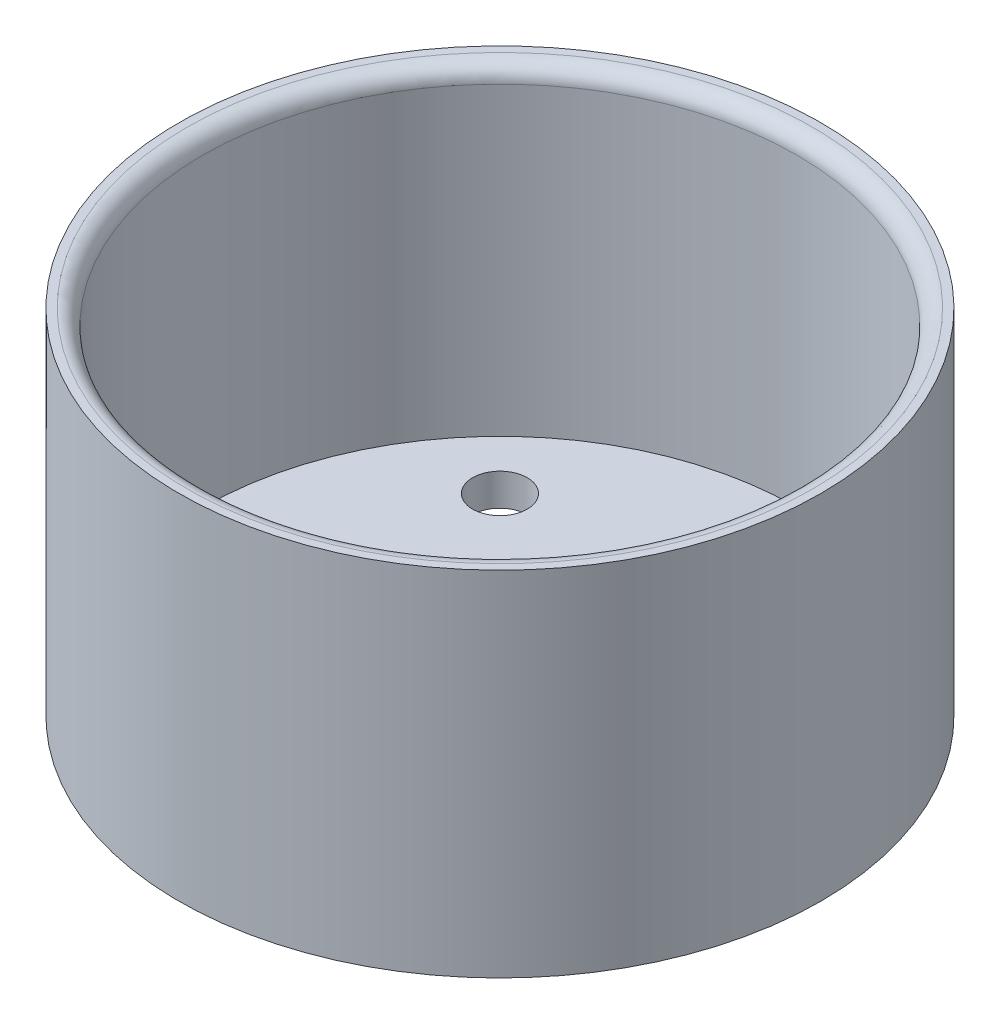
ISO-10303-21;
HEADER;
FILE_DESCRIPTION(('STEP AP214'),'2;1');
FILE_NAME('part.step','',(''),(''),'','','');
FILE_SCHEMA(('AUTOMOTIVE_DESIGN { 1 0 10303 214 1 1 1 1 }'));
ENDSEC;
DATA;
#1=APPLICATION_CONTEXT('core data for automotive mechanical design processes');
#2=APPLICATION_PROTOCOL_DEFINITION('international standard','automotive_design',2000,#1);
#3=PRODUCT_CONTEXT('',#1,'mechanical');
#4=PRODUCT('Part','Part','',(#3));
#5=PRODUCT_RELATED_PRODUCT_CATEGORY('part','',(#4));
#6=PRODUCT_DEFINITION_FORMATION('','',#4);
#7=PRODUCT_DEFINITION_CONTEXT('part definition',#1,'design');
#8=PRODUCT_DEFINITION('design','',#6,#7);
#9=PRODUCT_DEFINITION_SHAPE('','',#8);
#10=(LENGTH_UNIT() NAMED_UNIT(*) SI_UNIT(.MILLI.,.METRE.));
#11=(NAMED_UNIT(*) PLANE_ANGLE_UNIT() SI_UNIT($,.RADIAN.));
#12=(NAMED_UNIT(*) SI_UNIT($,.STERADIAN.) SOLID_ANGLE_UNIT());
#13=UNCERTAINTY_MEASURE_WITH_UNIT(LENGTH_MEASURE(1.E-05),#10,'distance_accuracy_value','');
#14=(GEOMETRIC_REPRESENTATION_CONTEXT(3) GLOBAL_UNCERTAINTY_ASSIGNED_CONTEXT((#13)) GLOBAL_UNIT_ASSIGNED_CONTEXT((#10,
#11,#12)) REPRESENTATION_CONTEXT('',''));
#15=CARTESIAN_POINT('',(0.,0.,0.));
#16=DIRECTION('',(0.,0.,1.));
#17=DIRECTION('',(1.,0.,0.));
#18=AXIS2_PLACEMENT_3D('',#15,#16,#17);
#19=CARTESIAN_POINT('',(-1.52655665885958E-13,22.,0.));
#20=DIRECTION('',(0.,1.,0.));
#21=DIRECTION('',(-1.,0.,0.));
#22=AXIS2_PLACEMENT_3D('',#19,#20,#21);
#23=PLANE('',#22);
#24=CARTESIAN_POINT('',(0.,22.,0.));
#25=DIRECTION('',(0.,-1.,0.));
#26=DIRECTION('',(1.,0.,0.));
#27=AXIS2_PLACEMENT_3D('',#24,#25,#26);
#28=CIRCLE('',#27,19.5);
#29=CARTESIAN_POINT('',(19.5,22.,0.));
#30=VERTEX_POINT('',#29);
#31=EDGE_CURVE('E10',#30,#30,#28,.T.);
#32=ORIENTED_EDGE('',*,*,#31,.T.);
#33=EDGE_LOOP('',(#32));
#34=FACE_BOUND('',#33,.T.);
#35=CARTESIAN_POINT('',(0.,22.,0.));
#36=DIRECTION('',(0.,-1.,0.));
#37=DIRECTION('',(1.,0.,0.));
#38=AXIS2_PLACEMENT_3D('',#35,#36,#37);
#39=CIRCLE('',#38,20.);
#40=CARTESIAN_POINT('',(20.,22.,0.));
#41=VERTEX_POINT('',#40);
#42=EDGE_CURVE('E62',#41,#41,#39,.T.);
#43=ORIENTED_EDGE('',*,*,#42,.F.);
#44=EDGE_LOOP('',(#43));
#45=FACE_BOUND('',#44,.T.);
#46=ADVANCED_FACE('F35',(#34,#45),#23,.T.);
#47=CARTESIAN_POINT('',(0.,21.,0.));
#48=DIRECTION('',(0.,-1.,0.));
#49=DIRECTION('',(1.,0.,0.));
#50=AXIS2_PLACEMENT_3D('',#47,#48,#49);
#51=TOROIDAL_SURFACE('',#50,19.5,0.999999999999999);
#52=CARTESIAN_POINT('',(0.,21.,0.));
#53=DIRECTION('',(0.,-1.,0.));
#54=DIRECTION('',(1.,0.,0.));
#55=AXIS2_PLACEMENT_3D('',#52,#53,#54);
#56=CIRCLE('',#55,18.5);
#57=CARTESIAN_POINT('',(18.5,21.,0.));
#58=VERTEX_POINT('',#57);
#59=EDGE_CURVE('E42',#58,#58,#56,.T.);
#60=ORIENTED_EDGE('',*,*,#59,.T.);
#61=EDGE_LOOP('',(#60));
#62=FACE_BOUND('',#61,.T.);
#63=ORIENTED_EDGE('',*,*,#31,.F.);
#64=EDGE_LOOP('',(#63));
#65=FACE_BOUND('',#64,.T.);
#66=ADVANCED_FACE('F91',(#62,#65),#51,.T.);
#67=CARTESIAN_POINT('',(0.,0.,0.));
#68=DIRECTION('',(0.,-1.,0.));
#69=DIRECTION('',(1.,0.,0.));
#70=AXIS2_PLACEMENT_3D('',#67,#68,#69);
#71=CYLINDRICAL_SURFACE('',#70,18.5);
#72=ORIENTED_EDGE('',*,*,#59,.F.);
#73=EDGE_LOOP('',(#72));
#74=FACE_BOUND('',#73,.T.);
#75=CARTESIAN_POINT('',(0.,2.,0.));
#76=DIRECTION('',(0.,-1.,0.));
#77=DIRECTION('',(1.,0.,0.));
#78=AXIS2_PLACEMENT_3D('',#75,#76,#77);
#79=CIRCLE('',#78,18.5);
#80=CARTESIAN_POINT('',(18.5,2.,0.));
#81=VERTEX_POINT('',#80);
#82=EDGE_CURVE('E47',#81,#81,#79,.T.);
#83=ORIENTED_EDGE('',*,*,#82,.T.);
#84=EDGE_LOOP('',(#83));
#85=FACE_BOUND('',#84,.T.);
#86=ADVANCED_FACE('F77',(#74,#85),#71,.F.);
#87=CARTESIAN_POINT('',(0.,2.,0.));
#88=DIRECTION('',(0.,-1.,0.));
#89=DIRECTION('',(1.,0.,0.));
#90=AXIS2_PLACEMENT_3D('',#87,#88,#89);
#91=PLANE('',#90);
#92=CARTESIAN_POINT('',(10.0000000000001,2.,-9.9999999999999));
#93=DIRECTION('',(0.,1.,0.));
#94=DIRECTION('',(-1.,0.,0.));
#95=AXIS2_PLACEMENT_3D('',#92,#93,#94);
#96=CIRCLE('',#95,1.7);
#97=CARTESIAN_POINT('',(8.30000000000011,2.,-9.9999999999999));
#98=VERTEX_POINT('',#97);
#99=EDGE_CURVE('E177',#98,#98,#96,.T.);
#100=ORIENTED_EDGE('',*,*,#99,.F.);
#101=EDGE_LOOP('',(#100));
#102=FACE_BOUND('',#101,.T.);
#103=CARTESIAN_POINT('',(-9.99999999999993,2.,-10.0000000000001));
#104=DIRECTION('',(0.,1.,0.));
#105=DIRECTION('',(-1.,0.,0.));
#106=AXIS2_PLACEMENT_3D('',#103,#104,#105);
#107=CIRCLE('',#106,1.7);
#108=CARTESIAN_POINT('',(-11.6999999999999,2.,-10.0000000000001));
#109=VERTEX_POINT('',#108);
#110=EDGE_CURVE('E178',#109,#109,#107,.T.);
#111=ORIENTED_EDGE('',*,*,#110,.F.);
#112=EDGE_LOOP('',(#111));
#113=FACE_BOUND('',#112,.T.);
#114=CARTESIAN_POINT('',(-10.,2.,9.99999999999996));
#115=DIRECTION('',(0.,1.,0.));
#116=DIRECTION('',(-1.,0.,0.));
#117=AXIS2_PLACEMENT_3D('',#114,#115,#116);
#118=CIRCLE('',#117,1.7);
#119=CARTESIAN_POINT('',(-11.7,2.,9.99999999999996));
#120=VERTEX_POINT('',#119);
#121=EDGE_CURVE('E180',#120,#120,#118,.T.);
#122=ORIENTED_EDGE('',*,*,#121,.F.);
#123=EDGE_LOOP('',(#122));
#124=FACE_BOUND('',#123,.T.);
#125=CARTESIAN_POINT('',(10.,2.,10.));
#126=DIRECTION('',(0.,1.,0.));
#127=DIRECTION('',(-1.,0.,0.));
#128=AXIS2_PLACEMENT_3D('',#125,#126,#127);
#129=CIRCLE('',#128,1.7);
#130=CARTESIAN_POINT('',(8.3,2.,10.));
#131=VERTEX_POINT('',#130);
#132=EDGE_CURVE('E55',#131,#131,#129,.T.);
#133=ORIENTED_EDGE('',*,*,#132,.F.);
#134=EDGE_LOOP('',(#133));
#135=FACE_BOUND('',#134,.T.);
#136=ORIENTED_EDGE('',*,*,#82,.F.);
#137=EDGE_LOOP('',(#136));
#138=FACE_BOUND('',#137,.T.);
#139=ADVANCED_FACE('F79',(#102,#113,#124,#135,#138),#91,.F.);
#140=CARTESIAN_POINT('',(0.,0.,0.));
#141=DIRECTION('',(0.,-1.,0.));
#142=DIRECTION('',(1.,0.,0.));
#143=AXIS2_PLACEMENT_3D('',#140,#141,#142);
#144=PLANE('',#143);
#145=CARTESIAN_POINT('',(10.0000000000001,0.,-9.9999999999999));
#146=DIRECTION('',(0.,-1.,0.));
#147=DIRECTION('',(1.,0.,0.));
#148=AXIS2_PLACEMENT_3D('',#145,#146,#147);
#149=CIRCLE('',#148,1.7);
#150=CARTESIAN_POINT('',(11.7000000000001,0.,-9.9999999999999));
#151=VERTEX_POINT('',#150);
#152=EDGE_CURVE('E38',#151,#151,#149,.T.);
#153=ORIENTED_EDGE('',*,*,#152,.F.);
#154=EDGE_LOOP('',(#153));
#155=FACE_BOUND('',#154,.T.);
#156=CARTESIAN_POINT('',(-9.99999999999993,0.,-10.0000000000001));
#157=DIRECTION('',(0.,-1.,0.));
#158=DIRECTION('',(1.,0.,0.));
#159=AXIS2_PLACEMENT_3D('',#156,#157,#158);
#160=CIRCLE('',#159,1.7);
#161=CARTESIAN_POINT('',(-8.29999999999993,0.,-10.0000000000001));
#162=VERTEX_POINT('',#161);
#163=EDGE_CURVE('E57',#162,#162,#160,.T.);
#164=ORIENTED_EDGE('',*,*,#163,.F.);
#165=EDGE_LOOP('',(#164));
#166=FACE_BOUND('',#165,.T.);
#167=CARTESIAN_POINT('',(-10.,0.,9.99999999999996));
#168=DIRECTION('',(0.,-1.,0.));
#169=DIRECTION('',(1.,0.,0.));
#170=AXIS2_PLACEMENT_3D('',#167,#168,#169);
#171=CIRCLE('',#170,1.7);
#172=CARTESIAN_POINT('',(-8.30000000000003,0.,9.99999999999996));
#173=VERTEX_POINT('',#172);
#174=EDGE_CURVE('E54',#173,#173,#171,.T.);
#175=ORIENTED_EDGE('',*,*,#174,.F.);
#176=EDGE_LOOP('',(#175));
#177=FACE_BOUND('',#176,.T.);
#178=CARTESIAN_POINT('',(10.,0.,10.));
#179=DIRECTION('',(0.,-1.,0.));
#180=DIRECTION('',(1.,0.,0.));
#181=AXIS2_PLACEMENT_3D('',#178,#179,#180);
#182=CIRCLE('',#181,1.7);
#183=CARTESIAN_POINT('',(11.7,0.,10.));
#184=VERTEX_POINT('',#183);
#185=EDGE_CURVE('E51',#184,#184,#182,.T.);
#186=ORIENTED_EDGE('',*,*,#185,.F.);
#187=EDGE_LOOP('',(#186));
#188=FACE_BOUND('',#187,.T.);
#189=CARTESIAN_POINT('',(0.,0.,0.));
#190=DIRECTION('',(0.,-1.,0.));
#191=DIRECTION('',(1.,0.,0.));
#192=AXIS2_PLACEMENT_3D('',#189,#190,#191);
#193=CIRCLE('',#192,20.);
#194=CARTESIAN_POINT('',(20.,0.,0.));
#195=VERTEX_POINT('',#194);
#196=EDGE_CURVE('E66',#195,#195,#193,.T.);
#197=ORIENTED_EDGE('',*,*,#196,.T.);
#198=EDGE_LOOP('',(#197));
#199=FACE_BOUND('',#198,.T.);
#200=ADVANCED_FACE('F81',(#155,#166,#177,#188,#199),#144,.T.);
#201=CARTESIAN_POINT('',(0.,0.,0.));
#202=DIRECTION('',(0.,-1.,0.));
#203=DIRECTION('',(1.,0.,0.));
#204=AXIS2_PLACEMENT_3D('',#201,#202,#203);
#205=CYLINDRICAL_SURFACE('',#204,20.);
#206=ORIENTED_EDGE('',*,*,#196,.F.);
#207=EDGE_LOOP('',(#206));
#208=FACE_BOUND('',#207,.T.);
#209=ORIENTED_EDGE('',*,*,#42,.T.);
#210=EDGE_LOOP('',(#209));
#211=FACE_BOUND('',#210,.T.);
#212=ADVANCED_FACE('F88',(#208,#211),#205,.T.);
#213=CARTESIAN_POINT('',(10.,-8.,10.));
#214=DIRECTION('',(0.,1.,0.));
#215=DIRECTION('',(-1.,0.,0.));
#216=AXIS2_PLACEMENT_3D('',#213,#214,#215);
#217=CYLINDRICAL_SURFACE('',#216,1.7);
#218=ORIENTED_EDGE('',*,*,#185,.T.);
#219=EDGE_LOOP('',(#218));
#220=FACE_BOUND('',#219,.T.);
#221=ORIENTED_EDGE('',*,*,#132,.T.);
#222=EDGE_LOOP('',(#221));
#223=FACE_BOUND('',#222,.T.);
#224=ADVANCED_FACE('F119',(#220,#223),#217,.F.);
#225=CARTESIAN_POINT('',(-10.,-8.,9.99999999999996));
#226=DIRECTION('',(0.,1.,0.));
#227=DIRECTION('',(-1.,0.,0.));
#228=AXIS2_PLACEMENT_3D('',#225,#226,#227);
#229=CYLINDRICAL_SURFACE('',#228,1.7);
#230=ORIENTED_EDGE('',*,*,#174,.T.);
#231=EDGE_LOOP('',(#230));
#232=FACE_BOUND('',#231,.T.);
#233=ORIENTED_EDGE('',*,*,#121,.T.);
#234=EDGE_LOOP('',(#233));
#235=FACE_BOUND('',#234,.T.);
#236=ADVANCED_FACE('F143',(#232,#235),#229,.F.);
#237=CARTESIAN_POINT('',(-9.99999999999993,-8.,-10.0000000000001));
#238=DIRECTION('',(0.,1.,0.));
#239=DIRECTION('',(-1.,0.,0.));
#240=AXIS2_PLACEMENT_3D('',#237,#238,#239);
#241=CYLINDRICAL_SURFACE('',#240,1.7);
#242=ORIENTED_EDGE('',*,*,#163,.T.);
#243=EDGE_LOOP('',(#242));
#244=FACE_BOUND('',#243,.T.);
#245=ORIENTED_EDGE('',*,*,#110,.T.);
#246=EDGE_LOOP('',(#245));
#247=FACE_BOUND('',#246,.T.);
#248=ADVANCED_FACE('F153',(#244,#247),#241,.F.);
#249=CARTESIAN_POINT('',(10.0000000000001,-8.,-9.9999999999999));
#250=DIRECTION('',(0.,1.,0.));
#251=DIRECTION('',(-1.,0.,0.));
#252=AXIS2_PLACEMENT_3D('',#249,#250,#251);
#253=CYLINDRICAL_SURFACE('',#252,1.7);
#254=ORIENTED_EDGE('',*,*,#152,.T.);
#255=EDGE_LOOP('',(#254));
#256=FACE_BOUND('',#255,.T.);
#257=ORIENTED_EDGE('',*,*,#99,.T.);
#258=EDGE_LOOP('',(#257));
#259=FACE_BOUND('',#258,.T.);
#260=ADVANCED_FACE('F163',(#256,#259),#253,.F.);
#261=CLOSED_SHELL('',(#46,#66,#86,#139,#200,#212,#224,#236,#248,#260));
#262=MANIFOLD_SOLID_BREP('B2',#261);
#263=ADVANCED_BREP_SHAPE_REPRESENTATION('',(#18,#262),#14);
#264=SHAPE_DEFINITION_REPRESENTATION(#9,#263);
ENDSEC;
END-ISO-10303-21;
